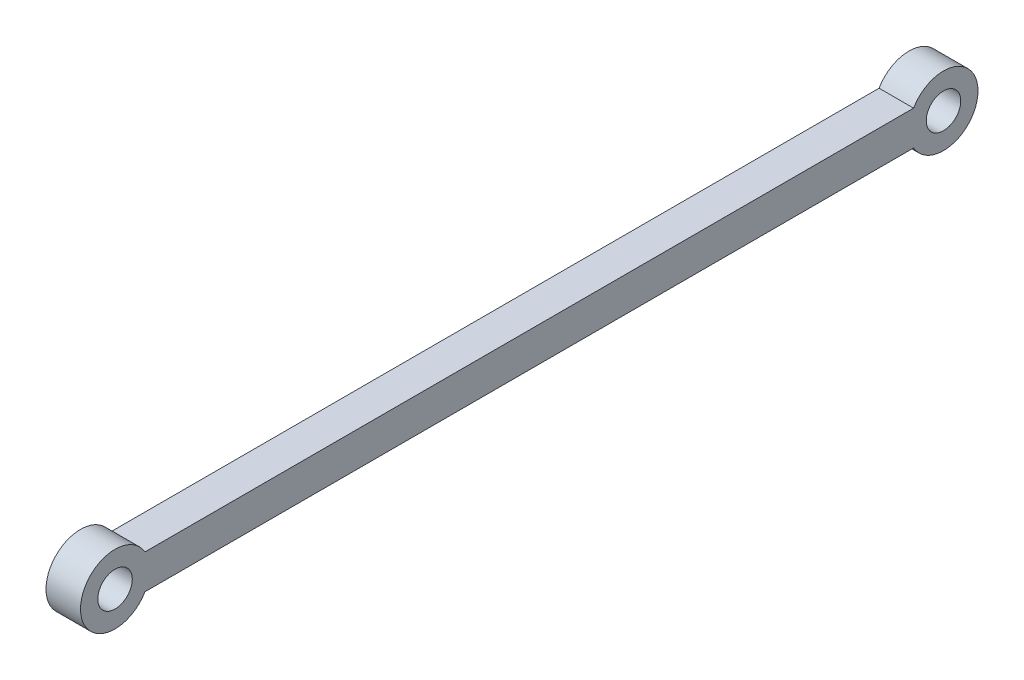
ISO-10303-21;
HEADER;
FILE_DESCRIPTION(('STEP AP214'),'2;1');
FILE_NAME('part.step','',(''),(''),'','','');
FILE_SCHEMA(('AUTOMOTIVE_DESIGN { 1 0 10303 214 1 1 1 1 }'));
ENDSEC;
DATA;
#1=APPLICATION_CONTEXT('core data for automotive mechanical design processes');
#2=APPLICATION_PROTOCOL_DEFINITION('international standard','automotive_design',2000,#1);
#3=PRODUCT_CONTEXT('',#1,'mechanical');
#4=PRODUCT('Part','Part','',(#3));
#5=PRODUCT_RELATED_PRODUCT_CATEGORY('part','',(#4));
#6=PRODUCT_DEFINITION_FORMATION('','',#4);
#7=PRODUCT_DEFINITION_CONTEXT('part definition',#1,'design');
#8=PRODUCT_DEFINITION('design','',#6,#7);
#9=PRODUCT_DEFINITION_SHAPE('','',#8);
#10=(LENGTH_UNIT() NAMED_UNIT(*) SI_UNIT(.MILLI.,.METRE.));
#11=(NAMED_UNIT(*) PLANE_ANGLE_UNIT() SI_UNIT($,.RADIAN.));
#12=(NAMED_UNIT(*) SI_UNIT($,.STERADIAN.) SOLID_ANGLE_UNIT());
#13=UNCERTAINTY_MEASURE_WITH_UNIT(LENGTH_MEASURE(1.E-05),#10,'distance_accuracy_value','');
#14=(GEOMETRIC_REPRESENTATION_CONTEXT(3) GLOBAL_UNCERTAINTY_ASSIGNED_CONTEXT((#13)) GLOBAL_UNIT_ASSIGNED_CONTEXT((#10,
#11,#12)) REPRESENTATION_CONTEXT('',''));
#15=CARTESIAN_POINT('',(0.,0.,0.));
#16=DIRECTION('',(0.,0.,1.));
#17=DIRECTION('',(1.,0.,0.));
#18=AXIS2_PLACEMENT_3D('',#15,#16,#17);
#19=CARTESIAN_POINT('',(2.5,0.,30.));
#20=DIRECTION('',(1.,0.,0.));
#21=DIRECTION('',(0.,0.,-1.));
#22=AXIS2_PLACEMENT_3D('',#19,#20,#21);
#23=PLANE('',#22);
#24=CARTESIAN_POINT('',(2.5,0.,30.));
#25=DIRECTION('',(1.,0.,0.));
#26=DIRECTION('',(0.,0.,-1.));
#27=AXIS2_PLACEMENT_3D('',#24,#25,#26);
#28=CIRCLE('',#27,1.25);
#29=CARTESIAN_POINT('',(2.5,0.,28.75));
#30=VERTEX_POINT('',#29);
#31=EDGE_CURVE('E104',#30,#30,#28,.T.);
#32=ORIENTED_EDGE('',*,*,#31,.F.);
#33=EDGE_LOOP('',(#32));
#34=FACE_BOUND('',#33,.T.);
#35=CARTESIAN_POINT('',(2.5,0.,30.));
#36=DIRECTION('',(1.,0.,0.));
#37=DIRECTION('',(0.,0.,-1.));
#38=AXIS2_PLACEMENT_3D('',#35,#36,#37);
#39=CIRCLE('',#38,2.5);
#40=CARTESIAN_POINT('',(2.5,1.25,27.8349364905389));
#41=VERTEX_POINT('',#40);
#42=CARTESIAN_POINT('',(2.5,-1.25,27.8349364905389));
#43=VERTEX_POINT('',#42);
#44=EDGE_CURVE('E89',#41,#43,#39,.T.);
#45=ORIENTED_EDGE('',*,*,#44,.T.);
#46=DIRECTION('',(0.,0.,-1.));
#47=VECTOR('',#46,1.);
#48=CARTESIAN_POINT('',(2.5,-1.25,27.8349364905389));
#49=LINE('',#48,#47);
#50=CARTESIAN_POINT('',(2.5,-1.25,-27.8349364905389));
#51=VERTEX_POINT('',#50);
#52=EDGE_CURVE('E84',#43,#51,#49,.T.);
#53=ORIENTED_EDGE('',*,*,#52,.T.);
#54=CARTESIAN_POINT('',(2.5,0.,-30.));
#55=DIRECTION('',(1.,0.,0.));
#56=DIRECTION('',(0.,0.,-1.));
#57=AXIS2_PLACEMENT_3D('',#54,#55,#56);
#58=CIRCLE('',#57,2.5);
#59=CARTESIAN_POINT('',(2.5,1.25,-27.8349364905389));
#60=VERTEX_POINT('',#59);
#61=EDGE_CURVE('E87',#51,#60,#58,.T.);
#62=ORIENTED_EDGE('',*,*,#61,.T.);
#63=DIRECTION('',(0.,0.,1.));
#64=VECTOR('',#63,1.);
#65=CARTESIAN_POINT('',(2.5,1.25,27.8349364905389));
#66=LINE('',#65,#64);
#67=EDGE_CURVE('E54',#60,#41,#66,.T.);
#68=ORIENTED_EDGE('',*,*,#67,.T.);
#69=EDGE_LOOP('',(#45,#53,#62,#68));
#70=FACE_BOUND('',#69,.T.);
#71=CARTESIAN_POINT('',(2.5,0.,-30.));
#72=DIRECTION('',(1.,0.,0.));
#73=DIRECTION('',(0.,0.,-1.));
#74=AXIS2_PLACEMENT_3D('',#71,#72,#73);
#75=CIRCLE('',#74,1.25);
#76=CARTESIAN_POINT('',(2.5,0.,-31.25));
#77=VERTEX_POINT('',#76);
#78=EDGE_CURVE('E119',#77,#77,#75,.T.);
#79=ORIENTED_EDGE('',*,*,#78,.F.);
#80=EDGE_LOOP('',(#79));
#81=FACE_BOUND('',#80,.T.);
#82=ADVANCED_FACE('F37',(#34,#70,#81),#23,.T.);
#83=CARTESIAN_POINT('',(0.,0.,30.));
#84=DIRECTION('',(1.,0.,0.));
#85=DIRECTION('',(0.,0.,-1.));
#86=AXIS2_PLACEMENT_3D('',#83,#84,#85);
#87=PLANE('',#86);
#88=CARTESIAN_POINT('',(0.,0.,30.));
#89=DIRECTION('',(1.,0.,0.));
#90=DIRECTION('',(0.,0.,-1.));
#91=AXIS2_PLACEMENT_3D('',#88,#89,#90);
#92=CIRCLE('',#91,2.5);
#93=CARTESIAN_POINT('',(0.,1.25,27.8349364905389));
#94=VERTEX_POINT('',#93);
#95=CARTESIAN_POINT('',(0.,-1.25,27.8349364905389));
#96=VERTEX_POINT('',#95);
#97=EDGE_CURVE('E101',#94,#96,#92,.T.);
#98=ORIENTED_EDGE('',*,*,#97,.F.);
#99=DIRECTION('',(0.,0.,1.));
#100=VECTOR('',#99,1.);
#101=CARTESIAN_POINT('',(0.,1.25,27.8349364905389));
#102=LINE('',#101,#100);
#103=CARTESIAN_POINT('',(0.,1.25,-27.8349364905389));
#104=VERTEX_POINT('',#103);
#105=EDGE_CURVE('E77',#104,#94,#102,.T.);
#106=ORIENTED_EDGE('',*,*,#105,.F.);
#107=CARTESIAN_POINT('',(0.,0.,-30.));
#108=DIRECTION('',(1.,0.,0.));
#109=DIRECTION('',(0.,0.,-1.));
#110=AXIS2_PLACEMENT_3D('',#107,#108,#109);
#111=CIRCLE('',#110,2.5);
#112=CARTESIAN_POINT('',(0.,-1.25,-27.8349364905389));
#113=VERTEX_POINT('',#112);
#114=EDGE_CURVE('E71',#113,#104,#111,.T.);
#115=ORIENTED_EDGE('',*,*,#114,.F.);
#116=DIRECTION('',(0.,0.,-1.));
#117=VECTOR('',#116,1.);
#118=CARTESIAN_POINT('',(0.,-1.25,27.8349364905389));
#119=LINE('',#118,#117);
#120=EDGE_CURVE('E93',#96,#113,#119,.T.);
#121=ORIENTED_EDGE('',*,*,#120,.F.);
#122=EDGE_LOOP('',(#98,#106,#115,#121));
#123=FACE_BOUND('',#122,.T.);
#124=CARTESIAN_POINT('',(0.,0.,30.));
#125=DIRECTION('',(1.,0.,0.));
#126=DIRECTION('',(0.,0.,-1.));
#127=AXIS2_PLACEMENT_3D('',#124,#125,#126);
#128=CIRCLE('',#127,1.25);
#129=CARTESIAN_POINT('',(0.,0.,28.75));
#130=VERTEX_POINT('',#129);
#131=EDGE_CURVE('E116',#130,#130,#128,.T.);
#132=ORIENTED_EDGE('',*,*,#131,.T.);
#133=EDGE_LOOP('',(#132));
#134=FACE_BOUND('',#133,.T.);
#135=CARTESIAN_POINT('',(0.,0.,-30.));
#136=DIRECTION('',(1.,0.,0.));
#137=DIRECTION('',(0.,0.,-1.));
#138=AXIS2_PLACEMENT_3D('',#135,#136,#137);
#139=CIRCLE('',#138,1.25);
#140=CARTESIAN_POINT('',(0.,0.,-31.25));
#141=VERTEX_POINT('',#140);
#142=EDGE_CURVE('E122',#141,#141,#139,.T.);
#143=ORIENTED_EDGE('',*,*,#142,.T.);
#144=EDGE_LOOP('',(#143));
#145=FACE_BOUND('',#144,.T.);
#146=ADVANCED_FACE('F112',(#123,#134,#145),#87,.F.);
#147=CARTESIAN_POINT('',(2.5,0.,30.));
#148=DIRECTION('',(-1.,0.,0.));
#149=DIRECTION('',(0.,0.,1.));
#150=AXIS2_PLACEMENT_3D('',#147,#148,#149);
#151=CYLINDRICAL_SURFACE('',#150,2.5);
#152=ORIENTED_EDGE('',*,*,#97,.T.);
#153=DIRECTION('',(-1.,0.,0.));
#154=VECTOR('',#153,1.);
#155=CARTESIAN_POINT('',(2.5,-1.25,27.8349364905389));
#156=LINE('',#155,#154);
#157=EDGE_CURVE('E11',#43,#96,#156,.T.);
#158=ORIENTED_EDGE('',*,*,#157,.F.);
#159=ORIENTED_EDGE('',*,*,#44,.F.);
#160=DIRECTION('',(-1.,0.,0.));
#161=VECTOR('',#160,1.);
#162=CARTESIAN_POINT('',(2.5,1.25,27.8349364905389));
#163=LINE('',#162,#161);
#164=EDGE_CURVE('E97',#41,#94,#163,.T.);
#165=ORIENTED_EDGE('',*,*,#164,.T.);
#166=EDGE_LOOP('',(#152,#158,#159,#165));
#167=FACE_BOUND('',#166,.T.);
#168=ADVANCED_FACE('F39',(#167),#151,.T.);
#169=CARTESIAN_POINT('',(2.5,-1.25,27.8349364905389));
#170=DIRECTION('',(0.,1.,0.));
#171=DIRECTION('',(0.,0.,1.));
#172=AXIS2_PLACEMENT_3D('',#169,#170,#171);
#173=PLANE('',#172);
#174=ORIENTED_EDGE('',*,*,#120,.T.);
#175=DIRECTION('',(-1.,0.,0.));
#176=VECTOR('',#175,1.);
#177=CARTESIAN_POINT('',(2.5,-1.25,-27.8349364905389));
#178=LINE('',#177,#176);
#179=EDGE_CURVE('E46',#51,#113,#178,.T.);
#180=ORIENTED_EDGE('',*,*,#179,.F.);
#181=ORIENTED_EDGE('',*,*,#52,.F.);
#182=ORIENTED_EDGE('',*,*,#157,.T.);
#183=EDGE_LOOP('',(#174,#180,#181,#182));
#184=FACE_BOUND('',#183,.T.);
#185=ADVANCED_FACE('F92',(#184),#173,.F.);
#186=CARTESIAN_POINT('',(2.5,0.,-30.));
#187=DIRECTION('',(-1.,0.,0.));
#188=DIRECTION('',(0.,0.,1.));
#189=AXIS2_PLACEMENT_3D('',#186,#187,#188);
#190=CYLINDRICAL_SURFACE('',#189,2.5);
#191=ORIENTED_EDGE('',*,*,#114,.T.);
#192=DIRECTION('',(-1.,0.,0.));
#193=VECTOR('',#192,1.);
#194=CARTESIAN_POINT('',(2.5,1.25,-27.8349364905389));
#195=LINE('',#194,#193);
#196=EDGE_CURVE('E94',#60,#104,#195,.T.);
#197=ORIENTED_EDGE('',*,*,#196,.F.);
#198=ORIENTED_EDGE('',*,*,#61,.F.);
#199=ORIENTED_EDGE('',*,*,#179,.T.);
#200=EDGE_LOOP('',(#191,#197,#198,#199));
#201=FACE_BOUND('',#200,.T.);
#202=ADVANCED_FACE('F95',(#201),#190,.T.);
#203=CARTESIAN_POINT('',(2.5,1.25,27.8349364905389));
#204=DIRECTION('',(0.,-1.,0.));
#205=DIRECTION('',(0.,0.,-1.));
#206=AXIS2_PLACEMENT_3D('',#203,#204,#205);
#207=PLANE('',#206);
#208=ORIENTED_EDGE('',*,*,#105,.T.);
#209=ORIENTED_EDGE('',*,*,#164,.F.);
#210=ORIENTED_EDGE('',*,*,#67,.F.);
#211=ORIENTED_EDGE('',*,*,#196,.T.);
#212=EDGE_LOOP('',(#208,#209,#210,#211));
#213=FACE_BOUND('',#212,.T.);
#214=ADVANCED_FACE('F109',(#213),#207,.F.);
#215=CARTESIAN_POINT('',(2.5,0.,30.));
#216=DIRECTION('',(-1.,0.,0.));
#217=DIRECTION('',(0.,0.,1.));
#218=AXIS2_PLACEMENT_3D('',#215,#216,#217);
#219=CYLINDRICAL_SURFACE('',#218,1.25);
#220=ORIENTED_EDGE('',*,*,#31,.T.);
#221=EDGE_LOOP('',(#220));
#222=FACE_BOUND('',#221,.T.);
#223=ORIENTED_EDGE('',*,*,#131,.F.);
#224=EDGE_LOOP('',(#223));
#225=FACE_BOUND('',#224,.T.);
#226=ADVANCED_FACE('F139',(#222,#225),#219,.F.);
#227=CARTESIAN_POINT('',(2.5,0.,-30.));
#228=DIRECTION('',(-1.,0.,0.));
#229=DIRECTION('',(0.,0.,1.));
#230=AXIS2_PLACEMENT_3D('',#227,#228,#229);
#231=CYLINDRICAL_SURFACE('',#230,1.25);
#232=ORIENTED_EDGE('',*,*,#78,.T.);
#233=EDGE_LOOP('',(#232));
#234=FACE_BOUND('',#233,.T.);
#235=ORIENTED_EDGE('',*,*,#142,.F.);
#236=EDGE_LOOP('',(#235));
#237=FACE_BOUND('',#236,.T.);
#238=ADVANCED_FACE('F128',(#234,#237),#231,.F.);
#239=CLOSED_SHELL('',(#82,#146,#168,#185,#202,#214,#226,#238));
#240=MANIFOLD_SOLID_BREP('B2',#239);
#241=ADVANCED_BREP_SHAPE_REPRESENTATION('',(#18,#240),#14);
#242=SHAPE_DEFINITION_REPRESENTATION(#9,#241);
ENDSEC;
END-ISO-10303-21;
